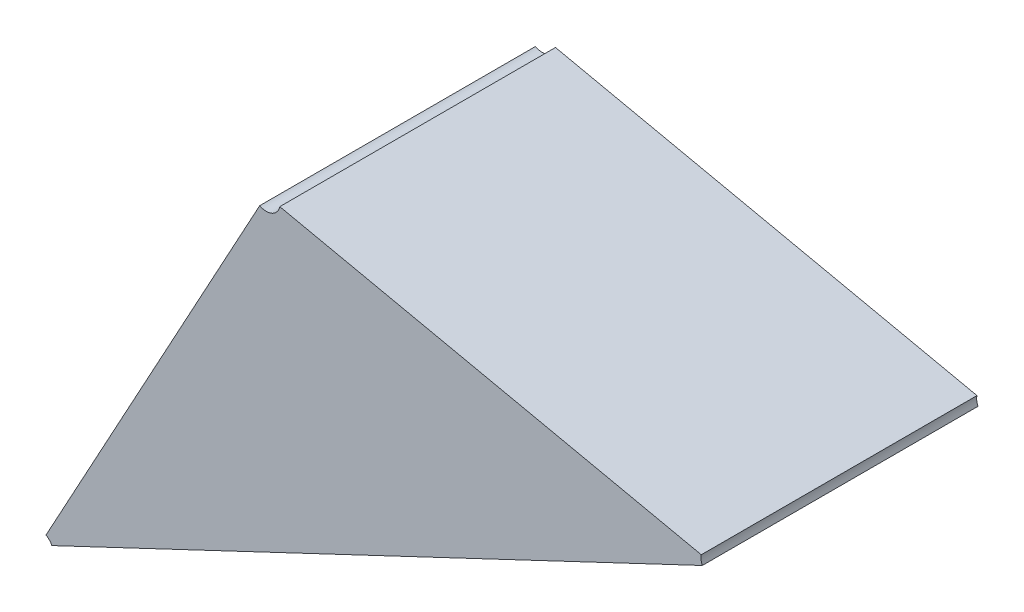
ISO-10303-21;
HEADER;
FILE_DESCRIPTION(('STEP AP214'),'2;1');
FILE_NAME('part.step','',(''),(''),'','','');
FILE_SCHEMA(('AUTOMOTIVE_DESIGN { 1 0 10303 214 1 1 1 1 }'));
ENDSEC;
DATA;
#1=APPLICATION_CONTEXT('core data for automotive mechanical design processes');
#2=APPLICATION_PROTOCOL_DEFINITION('international standard','automotive_design',2000,#1);
#3=PRODUCT_CONTEXT('',#1,'mechanical');
#4=PRODUCT('Part','Part','',(#3));
#5=PRODUCT_RELATED_PRODUCT_CATEGORY('part','',(#4));
#6=PRODUCT_DEFINITION_FORMATION('','',#4);
#7=PRODUCT_DEFINITION_CONTEXT('part definition',#1,'design');
#8=PRODUCT_DEFINITION('design','',#6,#7);
#9=PRODUCT_DEFINITION_SHAPE('','',#8);
#10=(LENGTH_UNIT() NAMED_UNIT(*) SI_UNIT(.MILLI.,.METRE.));
#11=(NAMED_UNIT(*) PLANE_ANGLE_UNIT() SI_UNIT($,.RADIAN.));
#12=(NAMED_UNIT(*) SI_UNIT($,.STERADIAN.) SOLID_ANGLE_UNIT());
#13=UNCERTAINTY_MEASURE_WITH_UNIT(LENGTH_MEASURE(1.E-05),#10,'distance_accuracy_value','');
#14=(GEOMETRIC_REPRESENTATION_CONTEXT(3) GLOBAL_UNCERTAINTY_ASSIGNED_CONTEXT((#13)) GLOBAL_UNIT_ASSIGNED_CONTEXT((#10,
#11,#12)) REPRESENTATION_CONTEXT('',''));
#15=CARTESIAN_POINT('',(0.,0.,0.));
#16=DIRECTION('',(0.,0.,1.));
#17=DIRECTION('',(1.,0.,0.));
#18=AXIS2_PLACEMENT_3D('',#15,#16,#17);
#19=CARTESIAN_POINT('',(-1.701648957739,-1.22650919463,0.1));
#20=DIRECTION('',(0.,0.,1.));
#21=DIRECTION('',(-1.,0.,0.));
#22=AXIS2_PLACEMENT_3D('',#19,#20,#21);
#23=CYLINDRICAL_SURFACE('',#22,0.00499999999999999);
#24=DIRECTION('',(0.,0.,-1.));
#25=VECTOR('',#24,1.);
#26=CARTESIAN_POINT('',(-1.704041899713,-1.230899391518,0.1));
#27=LINE('',#26,#25);
#28=CARTESIAN_POINT('',(-1.704041899713,-1.230899391518,0.1));
#29=VERTEX_POINT('',#28);
#30=CARTESIAN_POINT('',(-1.704041899713,-1.230899391518,0.));
#31=VERTEX_POINT('',#30);
#32=EDGE_CURVE('E11',#29,#31,#27,.T.);
#33=ORIENTED_EDGE('',*,*,#32,.F.);
#34=CARTESIAN_POINT('',(-1.701648957739,-1.22650919463,0.1));
#35=DIRECTION('',(0.,0.,-1.));
#36=DIRECTION('',(-1.,0.,0.));
#37=AXIS2_PLACEMENT_3D('',#34,#35,#36);
#38=CIRCLE('',#37,0.00499999999999999);
#39=CARTESIAN_POINT('',(-1.696760858039,-1.227561088791,0.1));
#40=VERTEX_POINT('',#39);
#41=EDGE_CURVE('E24',#40,#29,#38,.T.);
#42=ORIENTED_EDGE('',*,*,#41,.F.);
#43=DIRECTION('',(0.,0.,1.));
#44=VECTOR('',#43,1.);
#45=CARTESIAN_POINT('',(-1.696760858039,-1.227561088791,0.1));
#46=LINE('',#45,#44);
#47=CARTESIAN_POINT('',(-1.696760858039,-1.227561088791,0.));
#48=VERTEX_POINT('',#47);
#49=EDGE_CURVE('E115',#48,#40,#46,.T.);
#50=ORIENTED_EDGE('',*,*,#49,.F.);
#51=CARTESIAN_POINT('',(-1.701648957739,-1.22650919463,0.));
#52=DIRECTION('',(0.,0.,1.));
#53=DIRECTION('',(-1.,0.,0.));
#54=AXIS2_PLACEMENT_3D('',#51,#52,#53);
#55=CIRCLE('',#54,0.00499999999999999);
#56=EDGE_CURVE('E37',#31,#48,#55,.T.);
#57=ORIENTED_EDGE('',*,*,#56,.F.);
#58=EDGE_LOOP('',(#33,#42,#50,#57));
#59=FACE_BOUND('',#58,.T.);
#60=ADVANCED_FACE('F17',(#59),#23,.F.);
#61=CARTESIAN_POINT('',(-1.538975916512,-1.261515604607,0.1));
#62=DIRECTION('',(0.,0.,1.));
#63=DIRECTION('',(-1.,0.,0.));
#64=AXIS2_PLACEMENT_3D('',#61,#62,#63);
#65=CYLINDRICAL_SURFACE('',#64,0.00500000000000008);
#66=DIRECTION('',(0.,0.,-1.));
#67=VECTOR('',#66,1.);
#68=CARTESIAN_POINT('',(-1.543864016212,-1.260463710446,0.1));
#69=LINE('',#68,#67);
#70=CARTESIAN_POINT('',(-1.543864016212,-1.260463710446,0.1));
#71=VERTEX_POINT('',#70);
#72=CARTESIAN_POINT('',(-1.543864016212,-1.260463710446,0.));
#73=VERTEX_POINT('',#72);
#74=EDGE_CURVE('E111',#71,#73,#69,.T.);
#75=ORIENTED_EDGE('',*,*,#74,.F.);
#76=CARTESIAN_POINT('',(-1.538975916512,-1.261515604607,0.1));
#77=DIRECTION('',(0.,0.,-1.));
#78=DIRECTION('',(-1.,0.,0.));
#79=AXIS2_PLACEMENT_3D('',#76,#77,#78);
#80=CIRCLE('',#79,0.00500000000000008);
#81=CARTESIAN_POINT('',(-1.543494948502,-1.263655312501,0.1));
#82=VERTEX_POINT('',#81);
#83=EDGE_CURVE('E109',#82,#71,#80,.T.);
#84=ORIENTED_EDGE('',*,*,#83,.F.);
#85=DIRECTION('',(0.,0.,1.));
#86=VECTOR('',#85,1.);
#87=CARTESIAN_POINT('',(-1.543494948502,-1.263655312501,0.1));
#88=LINE('',#87,#86);
#89=CARTESIAN_POINT('',(-1.543494948502,-1.263655312501,0.));
#90=VERTEX_POINT('',#89);
#91=EDGE_CURVE('E89',#90,#82,#88,.T.);
#92=ORIENTED_EDGE('',*,*,#91,.F.);
#93=CARTESIAN_POINT('',(-1.538975916512,-1.261515604607,0.));
#94=DIRECTION('',(0.,0.,1.));
#95=DIRECTION('',(-1.,0.,0.));
#96=AXIS2_PLACEMENT_3D('',#93,#94,#95);
#97=CIRCLE('',#96,0.00500000000000008);
#98=EDGE_CURVE('E106',#73,#90,#97,.T.);
#99=ORIENTED_EDGE('',*,*,#98,.F.);
#100=EDGE_LOOP('',(#75,#84,#92,#99));
#101=FACE_BOUND('',#100,.T.);
#102=ADVANCED_FACE('F121',(#101),#65,.F.);
#103=CARTESIAN_POINT('',(-1.783954116023,-1.377509868132,0.1));
#104=DIRECTION('',(0.,0.,1.));
#105=DIRECTION('',(-1.,0.,0.));
#106=AXIS2_PLACEMENT_3D('',#103,#104,#105);
#107=CYLINDRICAL_SURFACE('',#106,0.00499999999999997);
#108=DIRECTION('',(0.,0.,1.));
#109=VECTOR('',#108,1.);
#110=CARTESIAN_POINT('',(-1.78156117405,-1.373119671244,0.1));
#111=LINE('',#110,#109);
#112=CARTESIAN_POINT('',(-1.78156117405,-1.373119671244,0.));
#113=VERTEX_POINT('',#112);
#114=CARTESIAN_POINT('',(-1.78156117405,-1.373119671244,0.1));
#115=VERTEX_POINT('',#114);
#116=EDGE_CURVE('E104',#113,#115,#111,.T.);
#117=ORIENTED_EDGE('',*,*,#116,.F.);
#118=CARTESIAN_POINT('',(-1.783954116023,-1.377509868132,0.));
#119=DIRECTION('',(0.,0.,1.));
#120=DIRECTION('',(-1.,0.,0.));
#121=AXIS2_PLACEMENT_3D('',#118,#119,#120);
#122=CIRCLE('',#121,0.00499999999999997);
#123=CARTESIAN_POINT('',(-1.779435084034,-1.375370160237,0.));
#124=VERTEX_POINT('',#123);
#125=EDGE_CURVE('E82',#124,#113,#122,.T.);
#126=ORIENTED_EDGE('',*,*,#125,.F.);
#127=DIRECTION('',(0.,0.,-1.));
#128=VECTOR('',#127,1.);
#129=CARTESIAN_POINT('',(-1.779435084034,-1.375370160237,0.1));
#130=LINE('',#129,#128);
#131=CARTESIAN_POINT('',(-1.779435084034,-1.375370160237,0.1));
#132=VERTEX_POINT('',#131);
#133=EDGE_CURVE('E77',#132,#124,#130,.T.);
#134=ORIENTED_EDGE('',*,*,#133,.F.);
#135=CARTESIAN_POINT('',(-1.783954116023,-1.377509868132,0.1));
#136=DIRECTION('',(0.,0.,-1.));
#137=DIRECTION('',(-1.,0.,0.));
#138=AXIS2_PLACEMENT_3D('',#135,#136,#137);
#139=CIRCLE('',#138,0.00499999999999997);
#140=EDGE_CURVE('E67',#115,#132,#139,.T.);
#141=ORIENTED_EDGE('',*,*,#140,.F.);
#142=EDGE_LOOP('',(#117,#126,#134,#141));
#143=FACE_BOUND('',#142,.T.);
#144=ADVANCED_FACE('F81',(#143),#107,.F.);
#145=CARTESIAN_POINT('',(-1.701648957739,-1.22650919463,0.));
#146=DIRECTION('',(-0.210378832050013,-0.977619939969144,0.));
#147=DIRECTION('',(0.977619939969144,-0.210378832050013,0.));
#148=AXIS2_PLACEMENT_3D('',#145,#146,#147);
#149=PLANE('',#148);
#150=ORIENTED_EDGE('',*,*,#49,.T.);
#151=DIRECTION('',(0.977619939969144,-0.210378832050013,0.));
#152=VECTOR('',#151,1.);
#153=CARTESIAN_POINT('',(-1.701648957739,-1.22650919463,0.1));
#154=LINE('',#153,#152);
#155=EDGE_CURVE('E78',#40,#71,#154,.T.);
#156=ORIENTED_EDGE('',*,*,#155,.T.);
#157=ORIENTED_EDGE('',*,*,#74,.T.);
#158=DIRECTION('',(0.977619939969144,-0.210378832050013,0.));
#159=VECTOR('',#158,1.);
#160=CARTESIAN_POINT('',(-1.701648957739,-1.22650919463,0.));
#161=LINE('',#160,#159);
#162=EDGE_CURVE('E93',#48,#73,#161,.T.);
#163=ORIENTED_EDGE('',*,*,#162,.F.);
#164=EDGE_LOOP('',(#150,#156,#157,#163));
#165=FACE_BOUND('',#164,.T.);
#166=ADVANCED_FACE('F118',(#165),#149,.F.);
#167=CARTESIAN_POINT('',(-1.673181282921,-1.293958844844,0.1));
#168=DIRECTION('',(0.,0.,-1.));
#169=DIRECTION('',(-1.,0.,0.));
#170=AXIS2_PLACEMENT_3D('',#167,#168,#169);
#171=PLANE('',#170);
#172=ORIENTED_EDGE('',*,*,#41,.T.);
#173=DIRECTION('',(0.478588394782364,0.878039377465294,0.));
#174=VECTOR('',#173,1.);
#175=CARTESIAN_POINT('',(-1.783954116023,-1.377509868132,0.1));
#176=LINE('',#175,#174);
#177=EDGE_CURVE('E73',#115,#29,#176,.T.);
#178=ORIENTED_EDGE('',*,*,#177,.F.);
#179=ORIENTED_EDGE('',*,*,#140,.T.);
#180=DIRECTION('',(-0.903806397975918,-0.427941578930813,0.));
#181=VECTOR('',#180,1.);
#182=CARTESIAN_POINT('',(-1.538975916512,-1.261515604607,0.1));
#183=LINE('',#182,#181);
#184=EDGE_CURVE('E71',#82,#132,#183,.T.);
#185=ORIENTED_EDGE('',*,*,#184,.F.);
#186=ORIENTED_EDGE('',*,*,#83,.T.);
#187=ORIENTED_EDGE('',*,*,#155,.F.);
#188=EDGE_LOOP('',(#172,#178,#179,#185,#186,#187));
#189=FACE_BOUND('',#188,.T.);
#190=ADVANCED_FACE('F69',(#189),#171,.F.);
#191=CARTESIAN_POINT('',(-1.538975916512,-1.261515604607,0.));
#192=DIRECTION('',(-0.427941578930813,0.903806397975918,0.));
#193=DIRECTION('',(-0.903806397975918,-0.427941578930813,0.));
#194=AXIS2_PLACEMENT_3D('',#191,#192,#193);
#195=PLANE('',#194);
#196=ORIENTED_EDGE('',*,*,#91,.T.);
#197=ORIENTED_EDGE('',*,*,#184,.T.);
#198=ORIENTED_EDGE('',*,*,#133,.T.);
#199=DIRECTION('',(-0.903806397975918,-0.427941578930813,0.));
#200=VECTOR('',#199,1.);
#201=CARTESIAN_POINT('',(-1.538975916512,-1.261515604607,0.));
#202=LINE('',#201,#200);
#203=EDGE_CURVE('E91',#90,#124,#202,.T.);
#204=ORIENTED_EDGE('',*,*,#203,.F.);
#205=EDGE_LOOP('',(#196,#197,#198,#204));
#206=FACE_BOUND('',#205,.T.);
#207=ADVANCED_FACE('F87',(#206),#195,.F.);
#208=CARTESIAN_POINT('',(-1.783954116023,-1.377509868132,0.));
#209=DIRECTION('',(0.878039377465294,-0.478588394782364,0.));
#210=DIRECTION('',(0.478588394782364,0.878039377465294,0.));
#211=AXIS2_PLACEMENT_3D('',#208,#209,#210);
#212=PLANE('',#211);
#213=ORIENTED_EDGE('',*,*,#32,.T.);
#214=DIRECTION('',(0.478588394782364,0.878039377465294,0.));
#215=VECTOR('',#214,1.);
#216=CARTESIAN_POINT('',(-1.783954116023,-1.377509868132,0.));
#217=LINE('',#216,#215);
#218=EDGE_CURVE('E95',#113,#31,#217,.T.);
#219=ORIENTED_EDGE('',*,*,#218,.F.);
#220=ORIENTED_EDGE('',*,*,#116,.T.);
#221=ORIENTED_EDGE('',*,*,#177,.T.);
#222=EDGE_LOOP('',(#213,#219,#220,#221));
#223=FACE_BOUND('',#222,.T.);
#224=ADVANCED_FACE('F127',(#223),#212,.F.);
#225=CARTESIAN_POINT('',(-1.673181282921,-1.293958844844,0.));
#226=DIRECTION('',(0.,0.,-1.));
#227=DIRECTION('',(-1.,0.,0.));
#228=AXIS2_PLACEMENT_3D('',#225,#226,#227);
#229=PLANE('',#228);
#230=ORIENTED_EDGE('',*,*,#56,.T.);
#231=ORIENTED_EDGE('',*,*,#162,.T.);
#232=ORIENTED_EDGE('',*,*,#98,.T.);
#233=ORIENTED_EDGE('',*,*,#203,.T.);
#234=ORIENTED_EDGE('',*,*,#125,.T.);
#235=ORIENTED_EDGE('',*,*,#218,.T.);
#236=EDGE_LOOP('',(#230,#231,#232,#233,#234,#235));
#237=FACE_BOUND('',#236,.T.);
#238=ADVANCED_FACE('F123',(#237),#229,.T.);
#239=CLOSED_SHELL('',(#60,#102,#144,#166,#190,#207,#224,#238));
#240=MANIFOLD_SOLID_BREP('B1',#239);
#241=ADVANCED_BREP_SHAPE_REPRESENTATION('',(#18,#240),#14);
#242=SHAPE_DEFINITION_REPRESENTATION(#9,#241);
ENDSEC;
END-ISO-10303-21;
